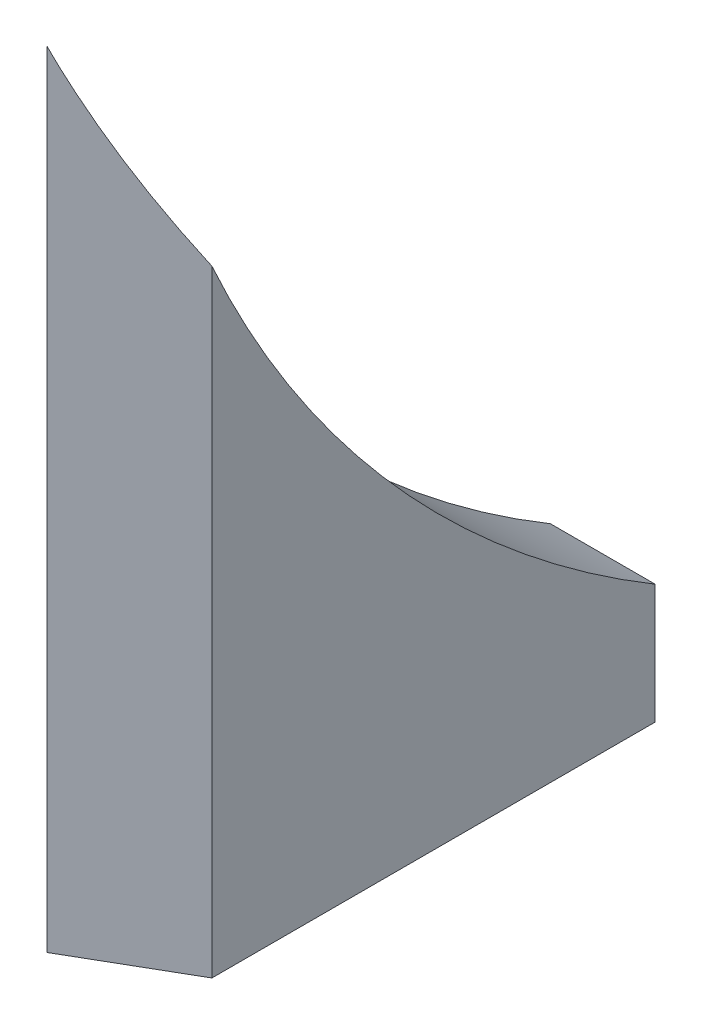
ISO-10303-21;
HEADER;
FILE_DESCRIPTION(('STEP AP214'),'2;1');
FILE_NAME('part.step','',(''),(''),'','','');
FILE_SCHEMA(('AUTOMOTIVE_DESIGN { 1 0 10303 214 1 1 1 1 }'));
ENDSEC;
DATA;
#1=APPLICATION_CONTEXT('core data for automotive mechanical design processes');
#2=APPLICATION_PROTOCOL_DEFINITION('international standard','automotive_design',2000,#1);
#3=PRODUCT_CONTEXT('',#1,'mechanical');
#4=PRODUCT('Part','Part','',(#3));
#5=PRODUCT_RELATED_PRODUCT_CATEGORY('part','',(#4));
#6=PRODUCT_DEFINITION_FORMATION('','',#4);
#7=PRODUCT_DEFINITION_CONTEXT('part definition',#1,'design');
#8=PRODUCT_DEFINITION('design','',#6,#7);
#9=PRODUCT_DEFINITION_SHAPE('','',#8);
#10=(LENGTH_UNIT() NAMED_UNIT(*) SI_UNIT(.MILLI.,.METRE.));
#11=(NAMED_UNIT(*) PLANE_ANGLE_UNIT() SI_UNIT($,.RADIAN.));
#12=(NAMED_UNIT(*) SI_UNIT($,.STERADIAN.) SOLID_ANGLE_UNIT());
#13=UNCERTAINTY_MEASURE_WITH_UNIT(LENGTH_MEASURE(1.E-05),#10,'distance_accuracy_value','');
#14=(GEOMETRIC_REPRESENTATION_CONTEXT(3) GLOBAL_UNCERTAINTY_ASSIGNED_CONTEXT((#13)) GLOBAL_UNIT_ASSIGNED_CONTEXT((#10,
#11,#12)) REPRESENTATION_CONTEXT('',''));
#15=CARTESIAN_POINT('',(0.,0.,0.));
#16=DIRECTION('',(0.,0.,1.));
#17=DIRECTION('',(1.,0.,0.));
#18=AXIS2_PLACEMENT_3D('',#15,#16,#17);
#19=CARTESIAN_POINT('',(4.,33.4342691998875,-29.2351488879258));
#20=DIRECTION('',(-1.,0.,0.));
#21=DIRECTION('',(0.,0.,1.));
#22=AXIS2_PLACEMENT_3D('',#19,#20,#21);
#23=CYLINDRICAL_SURFACE('',#22,42.5753320593088);
#24=CARTESIAN_POINT('',(0.,33.4342691998875,-29.2351488879258));
#25=DIRECTION('',(-1.,0.,0.));
#26=DIRECTION('',(0.,0.,-1.));
#27=AXIS2_PLACEMENT_3D('',#24,#25,#26);
#28=CIRCLE('',#27,42.5753320593088);
#29=CARTESIAN_POINT('',(0.,-3.10524913020123,-7.38286067443378));
#30=VERTEX_POINT('',#29);
#31=CARTESIAN_POINT('',(0.,22.3319809863954,11.8671393255662));
#32=VERTEX_POINT('',#31);
#33=EDGE_CURVE('E80',#30,#32,#28,.T.);
#34=ORIENTED_EDGE('',*,*,#33,.T.);
#35=CARTESIAN_POINT('',(71.1912514931086,33.4342691998875,-29.2351488879258));
#36=DIRECTION('',(-0.499999999999995,0.,-0.866025403784442));
#37=DIRECTION('',(-0.866025403784442,0.,0.499999999999995));
#38=AXIS2_PLACEMENT_3D('',#35,#36,#37);
#39=ELLIPSE('',#38,85.1506641186185,42.5753320593088);
#40=CARTESIAN_POINT('',(4.,15.8908713660281,9.55773824880774));
#41=VERTEX_POINT('',#40);
#42=EDGE_CURVE('E54',#32,#41,#39,.F.);
#43=ORIENTED_EDGE('',*,*,#42,.T.);
#44=CARTESIAN_POINT('',(4.,33.4342691998875,-29.2351488879258));
#45=DIRECTION('',(-1.,0.,0.));
#46=DIRECTION('',(0.,0.,-1.));
#47=AXIS2_PLACEMENT_3D('',#44,#45,#46);
#48=CIRCLE('',#47,42.5753320593088);
#49=CARTESIAN_POINT('',(4.,-3.10524913020123,-7.38286067443378));
#50=VERTEX_POINT('',#49);
#51=EDGE_CURVE('E89',#50,#41,#48,.T.);
#52=ORIENTED_EDGE('',*,*,#51,.F.);
#53=DIRECTION('',(-1.,0.,0.));
#54=VECTOR('',#53,1.);
#55=CARTESIAN_POINT('',(4.,-3.10524913020123,-7.38286067443378));
#56=LINE('',#55,#54);
#57=EDGE_CURVE('E94',#50,#30,#56,.T.);
#58=ORIENTED_EDGE('',*,*,#57,.T.);
#59=EDGE_LOOP('',(#34,#43,#52,#58));
#60=FACE_BOUND('',#59,.T.);
#61=ADVANCED_FACE('F33',(#60),#23,.F.);
#62=CARTESIAN_POINT('',(4.,-7.66801901360456,11.8671393255662));
#63=DIRECTION('',(0.,1.,0.));
#64=DIRECTION('',(0.,0.,1.));
#65=AXIS2_PLACEMENT_3D('',#62,#63,#64);
#66=PLANE('',#65);
#67=DIRECTION('',(0.,0.,-1.));
#68=VECTOR('',#67,1.);
#69=CARTESIAN_POINT('',(4.,-7.66801901360456,11.8671393255662));
#70=LINE('',#69,#68);
#71=CARTESIAN_POINT('',(4.,-7.66801901360456,9.55773824880774));
#72=VERTEX_POINT('',#71);
#73=CARTESIAN_POINT('',(4.,-7.66801901360457,-7.38286067443378));
#74=VERTEX_POINT('',#73);
#75=EDGE_CURVE('E40',#72,#74,#70,.T.);
#76=ORIENTED_EDGE('',*,*,#75,.F.);
#77=DIRECTION('',(0.866025403784442,0.,-0.499999999999995));
#78=VECTOR('',#77,1.);
#79=CARTESIAN_POINT('',(0.,-7.66801901360456,11.8671393255662));
#80=LINE('',#79,#78);
#81=CARTESIAN_POINT('',(0.,-7.66801901360456,11.8671393255662));
#82=VERTEX_POINT('',#81);
#83=EDGE_CURVE('E74',#82,#72,#80,.T.);
#84=ORIENTED_EDGE('',*,*,#83,.F.);
#85=DIRECTION('',(0.,0.,-1.));
#86=VECTOR('',#85,1.);
#87=CARTESIAN_POINT('',(0.,-7.66801901360456,11.8671393255662));
#88=LINE('',#87,#86);
#89=CARTESIAN_POINT('',(0.,-7.66801901360456,-7.38286067443378));
#90=VERTEX_POINT('',#89);
#91=EDGE_CURVE('E79',#82,#90,#88,.T.);
#92=ORIENTED_EDGE('',*,*,#91,.T.);
#93=DIRECTION('',(1.,0.,0.));
#94=VECTOR('',#93,1.);
#95=CARTESIAN_POINT('',(0.,-7.66801901360457,-7.38286067443378));
#96=LINE('',#95,#94);
#97=EDGE_CURVE('E47',#90,#74,#96,.T.);
#98=ORIENTED_EDGE('',*,*,#97,.T.);
#99=EDGE_LOOP('',(#76,#84,#92,#98));
#100=FACE_BOUND('',#99,.T.);
#101=ADVANCED_FACE('F85',(#100),#66,.F.);
#102=CARTESIAN_POINT('',(4.,33.4342691998875,-29.2351488879258));
#103=DIRECTION('',(1.,0.,0.));
#104=DIRECTION('',(0.,0.,-1.));
#105=AXIS2_PLACEMENT_3D('',#102,#103,#104);
#106=PLANE('',#105);
#107=DIRECTION('',(0.,-1.,0.));
#108=VECTOR('',#107,1.);
#109=CARTESIAN_POINT('',(4.,43.1319809863954,9.55773824880774));
#110=LINE('',#109,#108);
#111=EDGE_CURVE('E86',#41,#72,#110,.T.);
#112=ORIENTED_EDGE('',*,*,#111,.T.);
#113=ORIENTED_EDGE('',*,*,#75,.T.);
#114=DIRECTION('',(0.,-1.,0.));
#115=VECTOR('',#114,1.);
#116=CARTESIAN_POINT('',(4.,-7.66801901360457,-7.38286067443378));
#117=LINE('',#116,#115);
#118=EDGE_CURVE('E99',#50,#74,#117,.T.);
#119=ORIENTED_EDGE('',*,*,#118,.F.);
#120=ORIENTED_EDGE('',*,*,#51,.T.);
#121=EDGE_LOOP('',(#112,#113,#119,#120));
#122=FACE_BOUND('',#121,.T.);
#123=ADVANCED_FACE('F103',(#122),#106,.T.);
#124=CARTESIAN_POINT('',(0.,33.4342691998875,-29.2351488879258));
#125=DIRECTION('',(1.,0.,0.));
#126=DIRECTION('',(0.,0.,-1.));
#127=AXIS2_PLACEMENT_3D('',#124,#125,#126);
#128=PLANE('',#127);
#129=ORIENTED_EDGE('',*,*,#33,.F.);
#130=DIRECTION('',(0.,-1.,0.));
#131=VECTOR('',#130,1.);
#132=CARTESIAN_POINT('',(0.,33.4342691998875,-7.38286067443378));
#133=LINE('',#132,#131);
#134=EDGE_CURVE('E11',#30,#90,#133,.T.);
#135=ORIENTED_EDGE('',*,*,#134,.T.);
#136=ORIENTED_EDGE('',*,*,#91,.F.);
#137=DIRECTION('',(0.,-1.,0.));
#138=VECTOR('',#137,1.);
#139=CARTESIAN_POINT('',(0.,22.3319809863954,11.8671393255662));
#140=LINE('',#139,#138);
#141=EDGE_CURVE('E71',#32,#82,#140,.T.);
#142=ORIENTED_EDGE('',*,*,#141,.F.);
#143=EDGE_LOOP('',(#129,#135,#136,#142));
#144=FACE_BOUND('',#143,.T.);
#145=ADVANCED_FACE('F88',(#144),#128,.F.);
#146=CARTESIAN_POINT('',(0.,-7.66801901360457,-7.38286067443378));
#147=DIRECTION('',(0.,0.,1.));
#148=DIRECTION('',(1.,0.,0.));
#149=AXIS2_PLACEMENT_3D('',#146,#147,#148);
#150=PLANE('',#149);
#151=ORIENTED_EDGE('',*,*,#118,.T.);
#152=ORIENTED_EDGE('',*,*,#97,.F.);
#153=ORIENTED_EDGE('',*,*,#134,.F.);
#154=ORIENTED_EDGE('',*,*,#57,.F.);
#155=EDGE_LOOP('',(#151,#152,#153,#154));
#156=FACE_BOUND('',#155,.T.);
#157=ADVANCED_FACE('F107',(#156),#150,.F.);
#158=CARTESIAN_POINT('',(0.,43.1319809863954,11.8671393255662));
#159=DIRECTION('',(-0.499999999999995,0.,-0.866025403784442));
#160=DIRECTION('',(-0.866025403784442,0.,0.499999999999995));
#161=AXIS2_PLACEMENT_3D('',#158,#159,#160);
#162=PLANE('',#161);
#163=ORIENTED_EDGE('',*,*,#141,.T.);
#164=ORIENTED_EDGE('',*,*,#83,.T.);
#165=ORIENTED_EDGE('',*,*,#111,.F.);
#166=ORIENTED_EDGE('',*,*,#42,.F.);
#167=EDGE_LOOP('',(#163,#164,#165,#166));
#168=FACE_BOUND('',#167,.T.);
#169=ADVANCED_FACE('F73',(#168),#162,.F.);
#170=CLOSED_SHELL('',(#61,#101,#123,#145,#157,#169));
#171=MANIFOLD_SOLID_BREP('B2',#170);
#172=ADVANCED_BREP_SHAPE_REPRESENTATION('',(#18,#171),#14);
#173=SHAPE_DEFINITION_REPRESENTATION(#9,#172);
ENDSEC;
END-ISO-10303-21;
